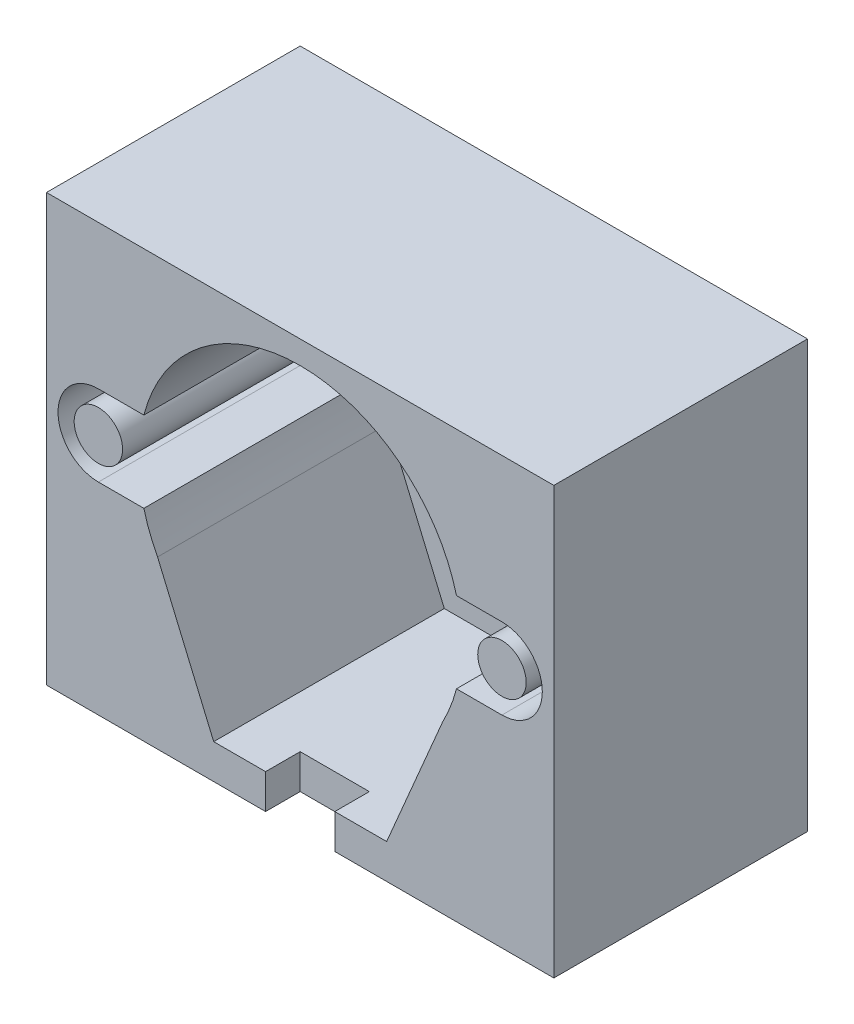
ISO-10303-21;
HEADER;
FILE_DESCRIPTION(('STEP AP214'),'2;1');
FILE_NAME('part.step','',(''),(''),'','','');
FILE_SCHEMA(('AUTOMOTIVE_DESIGN { 1 0 10303 214 1 1 1 1 }'));
ENDSEC;
DATA;
#1=APPLICATION_CONTEXT('core data for automotive mechanical design processes');
#2=APPLICATION_PROTOCOL_DEFINITION('international standard','automotive_design',2000,#1);
#3=PRODUCT_CONTEXT('',#1,'mechanical');
#4=PRODUCT('Part','Part','',(#3));
#5=PRODUCT_RELATED_PRODUCT_CATEGORY('part','',(#4));
#6=PRODUCT_DEFINITION_FORMATION('','',#4);
#7=PRODUCT_DEFINITION_CONTEXT('part definition',#1,'design');
#8=PRODUCT_DEFINITION('design','',#6,#7);
#9=PRODUCT_DEFINITION_SHAPE('','',#8);
#10=(LENGTH_UNIT() NAMED_UNIT(*) SI_UNIT(.MILLI.,.METRE.));
#11=(NAMED_UNIT(*) PLANE_ANGLE_UNIT() SI_UNIT($,.RADIAN.));
#12=(NAMED_UNIT(*) SI_UNIT($,.STERADIAN.) SOLID_ANGLE_UNIT());
#13=UNCERTAINTY_MEASURE_WITH_UNIT(LENGTH_MEASURE(1.E-05),#10,'distance_accuracy_value','');
#14=(GEOMETRIC_REPRESENTATION_CONTEXT(3) GLOBAL_UNCERTAINTY_ASSIGNED_CONTEXT((#13)) GLOBAL_UNIT_ASSIGNED_CONTEXT((#10,
#11,#12)) REPRESENTATION_CONTEXT('',''));
#15=CARTESIAN_POINT('',(0.,0.,0.));
#16=DIRECTION('',(0.,0.,1.));
#17=DIRECTION('',(1.,0.,0.));
#18=AXIS2_PLACEMENT_3D('',#15,#16,#17);
#19=CARTESIAN_POINT('',(22.,37.,22.));
#20=DIRECTION('',(-1.,0.,0.));
#21=DIRECTION('',(0.,-1.,0.));
#22=AXIS2_PLACEMENT_3D('',#19,#20,#21);
#23=PLANE('',#22);
#24=DIRECTION('',(0.,1.,0.));
#25=VECTOR('',#24,1.);
#26=CARTESIAN_POINT('',(22.,37.,0.));
#27=LINE('',#26,#25);
#28=CARTESIAN_POINT('',(22.,0.,0.));
#29=VERTEX_POINT('',#28);
#30=CARTESIAN_POINT('',(22.,37.,0.));
#31=VERTEX_POINT('',#30);
#32=EDGE_CURVE('E253',#29,#31,#27,.T.);
#33=ORIENTED_EDGE('',*,*,#32,.T.);
#34=DIRECTION('',(0.,0.,-1.));
#35=VECTOR('',#34,1.);
#36=CARTESIAN_POINT('',(22.,37.,22.));
#37=LINE('',#36,#35);
#38=CARTESIAN_POINT('',(22.,37.,22.));
#39=VERTEX_POINT('',#38);
#40=EDGE_CURVE('E11',#39,#31,#37,.T.);
#41=ORIENTED_EDGE('',*,*,#40,.F.);
#42=DIRECTION('',(0.,1.,0.));
#43=VECTOR('',#42,1.);
#44=CARTESIAN_POINT('',(22.,37.,22.));
#45=LINE('',#44,#43);
#46=CARTESIAN_POINT('',(22.,0.,22.));
#47=VERTEX_POINT('',#46);
#48=EDGE_CURVE('E288',#47,#39,#45,.T.);
#49=ORIENTED_EDGE('',*,*,#48,.F.);
#50=DIRECTION('',(0.,0.,-1.));
#51=VECTOR('',#50,1.);
#52=CARTESIAN_POINT('',(22.,0.,22.));
#53=LINE('',#52,#51);
#54=EDGE_CURVE('E302',#47,#29,#53,.T.);
#55=ORIENTED_EDGE('',*,*,#54,.T.);
#56=EDGE_LOOP('',(#33,#41,#49,#55));
#57=FACE_BOUND('',#56,.T.);
#58=ADVANCED_FACE('F39',(#57),#23,.F.);
#59=CARTESIAN_POINT('',(-22.,37.,22.));
#60=DIRECTION('',(0.,-1.,0.));
#61=DIRECTION('',(1.,0.,0.));
#62=AXIS2_PLACEMENT_3D('',#59,#60,#61);
#63=PLANE('',#62);
#64=DIRECTION('',(-1.,0.,0.));
#65=VECTOR('',#64,1.);
#66=CARTESIAN_POINT('',(-22.,37.,0.));
#67=LINE('',#66,#65);
#68=CARTESIAN_POINT('',(-22.,37.,0.));
#69=VERTEX_POINT('',#68);
#70=EDGE_CURVE('E306',#31,#69,#67,.T.);
#71=ORIENTED_EDGE('',*,*,#70,.T.);
#72=DIRECTION('',(0.,0.,-1.));
#73=VECTOR('',#72,1.);
#74=CARTESIAN_POINT('',(-22.,37.,22.));
#75=LINE('',#74,#73);
#76=CARTESIAN_POINT('',(-22.,37.,22.));
#77=VERTEX_POINT('',#76);
#78=EDGE_CURVE('E48',#77,#69,#75,.T.);
#79=ORIENTED_EDGE('',*,*,#78,.F.);
#80=DIRECTION('',(-1.,0.,0.));
#81=VECTOR('',#80,1.);
#82=CARTESIAN_POINT('',(-22.,37.,22.));
#83=LINE('',#82,#81);
#84=EDGE_CURVE('E292',#39,#77,#83,.T.);
#85=ORIENTED_EDGE('',*,*,#84,.F.);
#86=ORIENTED_EDGE('',*,*,#40,.T.);
#87=EDGE_LOOP('',(#71,#79,#85,#86));
#88=FACE_BOUND('',#87,.T.);
#89=ADVANCED_FACE('F471',(#88),#63,.F.);
#90=CARTESIAN_POINT('',(-22.,0.,22.));
#91=DIRECTION('',(1.,0.,0.));
#92=DIRECTION('',(0.,0.,-1.));
#93=AXIS2_PLACEMENT_3D('',#90,#91,#92);
#94=PLANE('',#93);
#95=DIRECTION('',(0.,-1.,0.));
#96=VECTOR('',#95,1.);
#97=CARTESIAN_POINT('',(-22.,0.,0.));
#98=LINE('',#97,#96);
#99=CARTESIAN_POINT('',(-22.,0.,0.));
#100=VERTEX_POINT('',#99);
#101=EDGE_CURVE('E309',#69,#100,#98,.T.);
#102=ORIENTED_EDGE('',*,*,#101,.T.);
#103=DIRECTION('',(0.,0.,-1.));
#104=VECTOR('',#103,1.);
#105=CARTESIAN_POINT('',(-22.,0.,22.));
#106=LINE('',#105,#104);
#107=CARTESIAN_POINT('',(-22.,0.,22.));
#108=VERTEX_POINT('',#107);
#109=EDGE_CURVE('E317',#108,#100,#106,.T.);
#110=ORIENTED_EDGE('',*,*,#109,.F.);
#111=DIRECTION('',(0.,-1.,0.));
#112=VECTOR('',#111,1.);
#113=CARTESIAN_POINT('',(-22.,0.,22.));
#114=LINE('',#113,#112);
#115=EDGE_CURVE('E296',#77,#108,#114,.T.);
#116=ORIENTED_EDGE('',*,*,#115,.F.);
#117=ORIENTED_EDGE('',*,*,#78,.T.);
#118=EDGE_LOOP('',(#102,#110,#116,#117));
#119=FACE_BOUND('',#118,.T.);
#120=ADVANCED_FACE('F327',(#119),#94,.F.);
#121=CARTESIAN_POINT('',(22.,0.,22.));
#122=DIRECTION('',(0.,1.,0.));
#123=DIRECTION('',(-1.,0.,0.));
#124=AXIS2_PLACEMENT_3D('',#121,#122,#123);
#125=PLANE('',#124);
#126=DIRECTION('',(1.,0.,0.));
#127=VECTOR('',#126,1.);
#128=CARTESIAN_POINT('',(22.,0.,22.));
#129=LINE('',#128,#127);
#130=CARTESIAN_POINT('',(3.00000000000001,0.,22.));
#131=VERTEX_POINT('',#130);
#132=EDGE_CURVE('E299',#131,#47,#129,.T.);
#133=ORIENTED_EDGE('',*,*,#132,.F.);
#134=DIRECTION('',(0.,0.,1.));
#135=VECTOR('',#134,1.);
#136=CARTESIAN_POINT('',(3.00000000000001,0.,22.));
#137=LINE('',#136,#135);
#138=CARTESIAN_POINT('',(3.00000000000001,0.,19.));
#139=VERTEX_POINT('',#138);
#140=EDGE_CURVE('E417',#139,#131,#137,.T.);
#141=ORIENTED_EDGE('',*,*,#140,.F.);
#142=DIRECTION('',(1.,0.,0.));
#143=VECTOR('',#142,1.);
#144=CARTESIAN_POINT('',(-2.99999999999999,0.,19.));
#145=LINE('',#144,#143);
#146=CARTESIAN_POINT('',(-2.99999999999999,0.,19.));
#147=VERTEX_POINT('',#146);
#148=EDGE_CURVE('E426',#147,#139,#145,.T.);
#149=ORIENTED_EDGE('',*,*,#148,.F.);
#150=DIRECTION('',(0.,0.,-1.));
#151=VECTOR('',#150,1.);
#152=CARTESIAN_POINT('',(-2.99999999999999,0.,22.));
#153=LINE('',#152,#151);
#154=CARTESIAN_POINT('',(-2.99999999999999,0.,22.));
#155=VERTEX_POINT('',#154);
#156=EDGE_CURVE('E422',#155,#147,#153,.T.);
#157=ORIENTED_EDGE('',*,*,#156,.F.);
#158=EDGE_CURVE('E195',#108,#155,#129,.T.);
#159=ORIENTED_EDGE('',*,*,#158,.F.);
#160=ORIENTED_EDGE('',*,*,#109,.T.);
#161=DIRECTION('',(1.,0.,0.));
#162=VECTOR('',#161,1.);
#163=CARTESIAN_POINT('',(22.,0.,0.));
#164=LINE('',#163,#162);
#165=EDGE_CURVE('E293',#100,#29,#164,.T.);
#166=ORIENTED_EDGE('',*,*,#165,.T.);
#167=ORIENTED_EDGE('',*,*,#54,.F.);
#168=EDGE_LOOP('',(#133,#141,#149,#157,#159,#160,#166,#167));
#169=FACE_BOUND('',#168,.T.);
#170=ADVANCED_FACE('F337',(#169),#125,.F.);
#171=CARTESIAN_POINT('',(0.,0.,22.));
#172=DIRECTION('',(0.,0.,-1.));
#173=DIRECTION('',(-1.,0.,0.));
#174=AXIS2_PLACEMENT_3D('',#171,#172,#173);
#175=PLANE('',#174);
#176=DIRECTION('',(1.,0.,0.));
#177=VECTOR('',#176,1.);
#178=CARTESIAN_POINT('',(-7.5,2.99999999999999,22.));
#179=LINE('',#178,#177);
#180=CARTESIAN_POINT('',(3.00000000000001,2.99999999999999,22.));
#181=VERTEX_POINT('',#180);
#182=CARTESIAN_POINT('',(7.5,2.99999999999999,22.));
#183=VERTEX_POINT('',#182);
#184=EDGE_CURVE('E204',#181,#183,#179,.T.);
#185=ORIENTED_EDGE('',*,*,#184,.F.);
#186=DIRECTION('',(0.,-1.,0.));
#187=VECTOR('',#186,1.);
#188=CARTESIAN_POINT('',(3.,37.001,22.));
#189=LINE('',#188,#187);
#190=EDGE_CURVE('E197',#181,#131,#189,.T.);
#191=ORIENTED_EDGE('',*,*,#190,.T.);
#192=ORIENTED_EDGE('',*,*,#132,.T.);
#193=ORIENTED_EDGE('',*,*,#48,.T.);
#194=ORIENTED_EDGE('',*,*,#84,.T.);
#195=ORIENTED_EDGE('',*,*,#115,.T.);
#196=ORIENTED_EDGE('',*,*,#158,.T.);
#197=DIRECTION('',(0.,-1.,0.));
#198=VECTOR('',#197,1.);
#199=CARTESIAN_POINT('',(-3.,37.001,22.));
#200=LINE('',#199,#198);
#201=CARTESIAN_POINT('',(-2.99999999999999,2.99999999999999,22.));
#202=VERTEX_POINT('',#201);
#203=EDGE_CURVE('E180',#202,#155,#200,.T.);
#204=ORIENTED_EDGE('',*,*,#203,.F.);
#205=CARTESIAN_POINT('',(-7.5,2.99999999999999,22.));
#206=VERTEX_POINT('',#205);
#207=EDGE_CURVE('E193',#206,#202,#179,.T.);
#208=ORIENTED_EDGE('',*,*,#207,.F.);
#209=DIRECTION('',(0.39154483745442,-0.920159029876245,0.));
#210=VECTOR('',#209,1.);
#211=CARTESIAN_POINT('',(-7.5,2.99999999999999,22.));
#212=LINE('',#211,#210);
#213=CARTESIAN_POINT('',(-12.3678315242219,14.4397604168396,22.));
#214=VERTEX_POINT('',#213);
#215=EDGE_CURVE('E63',#214,#206,#212,.T.);
#216=ORIENTED_EDGE('',*,*,#215,.F.);
#217=CARTESIAN_POINT('',(0.,21.,22.));
#218=DIRECTION('',(0.,0.,1.));
#219=DIRECTION('',(1.,0.,0.));
#220=AXIS2_PLACEMENT_3D('',#217,#218,#219);
#221=CIRCLE('',#220,14.);
#222=CARTESIAN_POINT('',(-13.555441711726,17.5,22.));
#223=VERTEX_POINT('',#222);
#224=EDGE_CURVE('E245',#223,#214,#221,.T.);
#225=ORIENTED_EDGE('',*,*,#224,.F.);
#226=DIRECTION('',(1.,0.,0.));
#227=VECTOR('',#226,1.);
#228=CARTESIAN_POINT('',(-17.5,17.5,22.));
#229=LINE('',#228,#227);
#230=CARTESIAN_POINT('',(-17.5,17.5,22.));
#231=VERTEX_POINT('',#230);
#232=EDGE_CURVE('E241',#231,#223,#229,.T.);
#233=ORIENTED_EDGE('',*,*,#232,.F.);
#234=CARTESIAN_POINT('',(-17.5,21.,22.));
#235=DIRECTION('',(0.,0.,1.));
#236=DIRECTION('',(1.,0.,0.));
#237=AXIS2_PLACEMENT_3D('',#234,#235,#236);
#238=CIRCLE('',#237,3.5);
#239=CARTESIAN_POINT('',(-17.5,24.5,22.));
#240=VERTEX_POINT('',#239);
#241=EDGE_CURVE('E237',#240,#231,#238,.T.);
#242=ORIENTED_EDGE('',*,*,#241,.F.);
#243=DIRECTION('',(-1.,0.,0.));
#244=VECTOR('',#243,1.);
#245=CARTESIAN_POINT('',(-17.5,24.5,22.));
#246=LINE('',#245,#244);
#247=CARTESIAN_POINT('',(-13.555441711726,24.5,22.));
#248=VERTEX_POINT('',#247);
#249=EDGE_CURVE('E233',#248,#240,#246,.T.);
#250=ORIENTED_EDGE('',*,*,#249,.F.);
#251=CARTESIAN_POINT('',(0.,21.,22.));
#252=DIRECTION('',(0.,0.,1.));
#253=DIRECTION('',(1.,0.,0.));
#254=AXIS2_PLACEMENT_3D('',#251,#252,#253);
#255=CIRCLE('',#254,14.);
#256=CARTESIAN_POINT('',(13.555441711726,24.5,22.));
#257=VERTEX_POINT('',#256);
#258=EDGE_CURVE('E229',#257,#248,#255,.T.);
#259=ORIENTED_EDGE('',*,*,#258,.F.);
#260=DIRECTION('',(-1.,0.,0.));
#261=VECTOR('',#260,1.);
#262=CARTESIAN_POINT('',(17.5,24.5,22.));
#263=LINE('',#262,#261);
#264=CARTESIAN_POINT('',(17.5,24.5,22.));
#265=VERTEX_POINT('',#264);
#266=EDGE_CURVE('E225',#265,#257,#263,.T.);
#267=ORIENTED_EDGE('',*,*,#266,.F.);
#268=CARTESIAN_POINT('',(17.5,21.,22.));
#269=DIRECTION('',(0.,0.,1.));
#270=DIRECTION('',(-1.,0.,0.));
#271=AXIS2_PLACEMENT_3D('',#268,#269,#270);
#272=CIRCLE('',#271,3.5);
#273=CARTESIAN_POINT('',(17.5,17.5,22.));
#274=VERTEX_POINT('',#273);
#275=EDGE_CURVE('E221',#274,#265,#272,.T.);
#276=ORIENTED_EDGE('',*,*,#275,.F.);
#277=DIRECTION('',(1.,0.,0.));
#278=VECTOR('',#277,1.);
#279=CARTESIAN_POINT('',(17.5,17.5,22.));
#280=LINE('',#279,#278);
#281=CARTESIAN_POINT('',(13.555441711726,17.5,22.));
#282=VERTEX_POINT('',#281);
#283=EDGE_CURVE('E217',#282,#274,#280,.T.);
#284=ORIENTED_EDGE('',*,*,#283,.F.);
#285=CARTESIAN_POINT('',(0.,21.,22.));
#286=DIRECTION('',(0.,0.,1.));
#287=DIRECTION('',(1.,0.,0.));
#288=AXIS2_PLACEMENT_3D('',#285,#286,#287);
#289=CIRCLE('',#288,14.);
#290=CARTESIAN_POINT('',(12.3678315242219,14.4397604168396,22.));
#291=VERTEX_POINT('',#290);
#292=EDGE_CURVE('E209',#291,#282,#289,.T.);
#293=ORIENTED_EDGE('',*,*,#292,.F.);
#294=DIRECTION('',(0.39154483745442,0.920159029876245,0.));
#295=VECTOR('',#294,1.);
#296=CARTESIAN_POINT('',(7.5,2.99999999999999,22.));
#297=LINE('',#296,#295);
#298=EDGE_CURVE('E203',#183,#291,#297,.T.);
#299=ORIENTED_EDGE('',*,*,#298,.F.);
#300=EDGE_LOOP('',(#185,#191,#192,#193,#194,#195,#196,#204,#208,#216,#225,#233,#242,#250,#259,
#267,#276,#284,#293,#299));
#301=FACE_BOUND('',#300,.T.);
#302=ADVANCED_FACE('F192',(#301),#175,.F.);
#303=CARTESIAN_POINT('',(0.,0.,0.));
#304=DIRECTION('',(0.,0.,-1.));
#305=DIRECTION('',(-1.,0.,0.));
#306=AXIS2_PLACEMENT_3D('',#303,#304,#305);
#307=PLANE('',#306);
#308=CARTESIAN_POINT('',(0.,20.9143154390346,0.));
#309=DIRECTION('',(0.,0.,-1.));
#310=DIRECTION('',(-1.,0.,0.));
#311=AXIS2_PLACEMENT_3D('',#308,#309,#310);
#312=CIRCLE('',#311,8.);
#313=CARTESIAN_POINT('',(-8.,20.9143154390346,0.));
#314=VERTEX_POINT('',#313);
#315=EDGE_CURVE('E408',#314,#314,#312,.T.);
#316=ORIENTED_EDGE('',*,*,#315,.F.);
#317=EDGE_LOOP('',(#316));
#318=FACE_BOUND('',#317,.T.);
#319=ORIENTED_EDGE('',*,*,#32,.F.);
#320=ORIENTED_EDGE('',*,*,#165,.F.);
#321=ORIENTED_EDGE('',*,*,#101,.F.);
#322=ORIENTED_EDGE('',*,*,#70,.F.);
#323=EDGE_LOOP('',(#319,#320,#321,#322));
#324=FACE_BOUND('',#323,.T.);
#325=ADVANCED_FACE('F333',(#318,#324),#307,.T.);
#326=CARTESIAN_POINT('',(-7.5,2.99999999999999,2.));
#327=DIRECTION('',(-0.920159029876245,-0.39154483745442,0.));
#328=DIRECTION('',(0.39154483745442,-0.920159029876245,0.));
#329=AXIS2_PLACEMENT_3D('',#326,#327,#328);
#330=PLANE('',#329);
#331=ORIENTED_EDGE('',*,*,#215,.T.);
#332=DIRECTION('',(0.,0.,1.));
#333=VECTOR('',#332,1.);
#334=CARTESIAN_POINT('',(-7.5,2.99999999999999,2.));
#335=LINE('',#334,#333);
#336=CARTESIAN_POINT('',(-7.5,2.99999999999999,2.));
#337=VERTEX_POINT('',#336);
#338=EDGE_CURVE('E201',#337,#206,#335,.T.);
#339=ORIENTED_EDGE('',*,*,#338,.F.);
#340=DIRECTION('',(0.39154483745442,-0.920159029876245,0.));
#341=VECTOR('',#340,1.);
#342=CARTESIAN_POINT('',(-7.5,2.99999999999999,2.));
#343=LINE('',#342,#341);
#344=CARTESIAN_POINT('',(-12.3678315242219,14.4397604168396,2.));
#345=VERTEX_POINT('',#344);
#346=EDGE_CURVE('E249',#345,#337,#343,.T.);
#347=ORIENTED_EDGE('',*,*,#346,.F.);
#348=DIRECTION('',(0.,0.,1.));
#349=VECTOR('',#348,1.);
#350=CARTESIAN_POINT('',(-12.3678315242219,14.4397604168396,2.));
#351=LINE('',#350,#349);
#352=EDGE_CURVE('E250',#345,#214,#351,.T.);
#353=ORIENTED_EDGE('',*,*,#352,.T.);
#354=EDGE_LOOP('',(#331,#339,#347,#353));
#355=FACE_BOUND('',#354,.T.);
#356=ADVANCED_FACE('F482',(#355),#330,.F.);
#357=CARTESIAN_POINT('',(0.,21.,2.));
#358=DIRECTION('',(0.,0.,1.));
#359=DIRECTION('',(1.,0.,0.));
#360=AXIS2_PLACEMENT_3D('',#357,#358,#359);
#361=CYLINDRICAL_SURFACE('',#360,14.);
#362=ORIENTED_EDGE('',*,*,#224,.T.);
#363=ORIENTED_EDGE('',*,*,#352,.F.);
#364=CARTESIAN_POINT('',(0.,21.,2.));
#365=DIRECTION('',(0.,0.,1.));
#366=DIRECTION('',(1.,0.,0.));
#367=AXIS2_PLACEMENT_3D('',#364,#365,#366);
#368=CIRCLE('',#367,14.);
#369=CARTESIAN_POINT('',(-13.555441711726,17.5,2.));
#370=VERTEX_POINT('',#369);
#371=EDGE_CURVE('E287',#370,#345,#368,.T.);
#372=ORIENTED_EDGE('',*,*,#371,.F.);
#373=DIRECTION('',(0.,0.,1.));
#374=VECTOR('',#373,1.);
#375=CARTESIAN_POINT('',(-13.555441711726,17.5,2.));
#376=LINE('',#375,#374);
#377=EDGE_CURVE('E254',#370,#223,#376,.T.);
#378=ORIENTED_EDGE('',*,*,#377,.T.);
#379=EDGE_LOOP('',(#362,#363,#372,#378));
#380=FACE_BOUND('',#379,.T.);
#381=ADVANCED_FACE('F487',(#380),#361,.F.);
#382=CARTESIAN_POINT('',(-17.5,17.5,2.));
#383=DIRECTION('',(0.,-1.,0.));
#384=DIRECTION('',(0.,0.,-1.));
#385=AXIS2_PLACEMENT_3D('',#382,#383,#384);
#386=PLANE('',#385);
#387=ORIENTED_EDGE('',*,*,#232,.T.);
#388=ORIENTED_EDGE('',*,*,#377,.F.);
#389=DIRECTION('',(1.,0.,0.));
#390=VECTOR('',#389,1.);
#391=CARTESIAN_POINT('',(-17.5,17.5,2.));
#392=LINE('',#391,#390);
#393=CARTESIAN_POINT('',(-17.5,17.5,2.));
#394=VERTEX_POINT('',#393);
#395=EDGE_CURVE('E347',#394,#370,#392,.T.);
#396=ORIENTED_EDGE('',*,*,#395,.F.);
#397=DIRECTION('',(0.,0.,1.));
#398=VECTOR('',#397,1.);
#399=CARTESIAN_POINT('',(-17.5,17.5,2.));
#400=LINE('',#399,#398);
#401=EDGE_CURVE('E257',#394,#231,#400,.T.);
#402=ORIENTED_EDGE('',*,*,#401,.T.);
#403=EDGE_LOOP('',(#387,#388,#396,#402));
#404=FACE_BOUND('',#403,.T.);
#405=ADVANCED_FACE('F501',(#404),#386,.F.);
#406=CARTESIAN_POINT('',(-17.5,21.,2.));
#407=DIRECTION('',(0.,0.,1.));
#408=DIRECTION('',(1.,0.,0.));
#409=AXIS2_PLACEMENT_3D('',#406,#407,#408);
#410=CYLINDRICAL_SURFACE('',#409,3.5);
#411=ORIENTED_EDGE('',*,*,#241,.T.);
#412=ORIENTED_EDGE('',*,*,#401,.F.);
#413=CARTESIAN_POINT('',(-17.5,21.,2.));
#414=DIRECTION('',(0.,0.,1.));
#415=DIRECTION('',(1.,0.,0.));
#416=AXIS2_PLACEMENT_3D('',#413,#414,#415);
#417=CIRCLE('',#416,3.5);
#418=CARTESIAN_POINT('',(-17.5,24.5,2.));
#419=VERTEX_POINT('',#418);
#420=EDGE_CURVE('E350',#419,#394,#417,.T.);
#421=ORIENTED_EDGE('',*,*,#420,.F.);
#422=DIRECTION('',(0.,0.,1.));
#423=VECTOR('',#422,1.);
#424=CARTESIAN_POINT('',(-17.5,24.5,2.));
#425=LINE('',#424,#423);
#426=EDGE_CURVE('E260',#419,#240,#425,.T.);
#427=ORIENTED_EDGE('',*,*,#426,.T.);
#428=EDGE_LOOP('',(#411,#412,#421,#427));
#429=FACE_BOUND('',#428,.T.);
#430=ADVANCED_FACE('F505',(#429),#410,.F.);
#431=CARTESIAN_POINT('',(-17.5,24.5,2.));
#432=DIRECTION('',(0.,1.,0.));
#433=DIRECTION('',(0.,0.,1.));
#434=AXIS2_PLACEMENT_3D('',#431,#432,#433);
#435=PLANE('',#434);
#436=ORIENTED_EDGE('',*,*,#249,.T.);
#437=ORIENTED_EDGE('',*,*,#426,.F.);
#438=DIRECTION('',(-1.,0.,0.));
#439=VECTOR('',#438,1.);
#440=CARTESIAN_POINT('',(-17.5,24.5,2.));
#441=LINE('',#440,#439);
#442=CARTESIAN_POINT('',(-13.555441711726,24.5,2.));
#443=VERTEX_POINT('',#442);
#444=EDGE_CURVE('E354',#443,#419,#441,.T.);
#445=ORIENTED_EDGE('',*,*,#444,.F.);
#446=DIRECTION('',(0.,0.,1.));
#447=VECTOR('',#446,1.);
#448=CARTESIAN_POINT('',(-13.555441711726,24.5,2.));
#449=LINE('',#448,#447);
#450=EDGE_CURVE('E263',#443,#248,#449,.T.);
#451=ORIENTED_EDGE('',*,*,#450,.T.);
#452=EDGE_LOOP('',(#436,#437,#445,#451));
#453=FACE_BOUND('',#452,.T.);
#454=ADVANCED_FACE('F509',(#453),#435,.F.);
#455=CARTESIAN_POINT('',(0.,21.,2.));
#456=DIRECTION('',(0.,0.,1.));
#457=DIRECTION('',(1.,0.,0.));
#458=AXIS2_PLACEMENT_3D('',#455,#456,#457);
#459=CYLINDRICAL_SURFACE('',#458,14.);
#460=ORIENTED_EDGE('',*,*,#258,.T.);
#461=ORIENTED_EDGE('',*,*,#450,.F.);
#462=CARTESIAN_POINT('',(0.,21.,2.));
#463=DIRECTION('',(0.,0.,1.));
#464=DIRECTION('',(1.,0.,0.));
#465=AXIS2_PLACEMENT_3D('',#462,#463,#464);
#466=CIRCLE('',#465,14.);
#467=CARTESIAN_POINT('',(13.555441711726,24.5,2.));
#468=VERTEX_POINT('',#467);
#469=EDGE_CURVE('E358',#468,#443,#466,.T.);
#470=ORIENTED_EDGE('',*,*,#469,.F.);
#471=DIRECTION('',(0.,0.,1.));
#472=VECTOR('',#471,1.);
#473=CARTESIAN_POINT('',(13.555441711726,24.5,2.));
#474=LINE('',#473,#472);
#475=EDGE_CURVE('E266',#468,#257,#474,.T.);
#476=ORIENTED_EDGE('',*,*,#475,.T.);
#477=EDGE_LOOP('',(#460,#461,#470,#476));
#478=FACE_BOUND('',#477,.T.);
#479=ADVANCED_FACE('F513',(#478),#459,.F.);
#480=CARTESIAN_POINT('',(17.5,24.5,2.));
#481=DIRECTION('',(0.,1.,0.));
#482=DIRECTION('',(0.,0.,1.));
#483=AXIS2_PLACEMENT_3D('',#480,#481,#482);
#484=PLANE('',#483);
#485=ORIENTED_EDGE('',*,*,#266,.T.);
#486=ORIENTED_EDGE('',*,*,#475,.F.);
#487=DIRECTION('',(-1.,0.,0.));
#488=VECTOR('',#487,1.);
#489=CARTESIAN_POINT('',(17.5,24.5,2.));
#490=LINE('',#489,#488);
#491=CARTESIAN_POINT('',(17.5,24.5,2.));
#492=VERTEX_POINT('',#491);
#493=EDGE_CURVE('E362',#492,#468,#490,.T.);
#494=ORIENTED_EDGE('',*,*,#493,.F.);
#495=DIRECTION('',(0.,0.,1.));
#496=VECTOR('',#495,1.);
#497=CARTESIAN_POINT('',(17.5,24.5,2.));
#498=LINE('',#497,#496);
#499=EDGE_CURVE('E269',#492,#265,#498,.T.);
#500=ORIENTED_EDGE('',*,*,#499,.T.);
#501=EDGE_LOOP('',(#485,#486,#494,#500));
#502=FACE_BOUND('',#501,.T.);
#503=ADVANCED_FACE('F517',(#502),#484,.F.);
#504=CARTESIAN_POINT('',(17.5,21.,2.));
#505=DIRECTION('',(0.,0.,1.));
#506=DIRECTION('',(1.,0.,0.));
#507=AXIS2_PLACEMENT_3D('',#504,#505,#506);
#508=CYLINDRICAL_SURFACE('',#507,3.5);
#509=ORIENTED_EDGE('',*,*,#275,.T.);
#510=ORIENTED_EDGE('',*,*,#499,.F.);
#511=CARTESIAN_POINT('',(17.5,21.,2.));
#512=DIRECTION('',(0.,0.,1.));
#513=DIRECTION('',(-1.,0.,0.));
#514=AXIS2_PLACEMENT_3D('',#511,#512,#513);
#515=CIRCLE('',#514,3.5);
#516=CARTESIAN_POINT('',(17.5,17.5,2.));
#517=VERTEX_POINT('',#516);
#518=EDGE_CURVE('E366',#517,#492,#515,.T.);
#519=ORIENTED_EDGE('',*,*,#518,.F.);
#520=DIRECTION('',(0.,0.,1.));
#521=VECTOR('',#520,1.);
#522=CARTESIAN_POINT('',(17.5,17.5,2.));
#523=LINE('',#522,#521);
#524=EDGE_CURVE('E272',#517,#274,#523,.T.);
#525=ORIENTED_EDGE('',*,*,#524,.T.);
#526=EDGE_LOOP('',(#509,#510,#519,#525));
#527=FACE_BOUND('',#526,.T.);
#528=ADVANCED_FACE('F521',(#527),#508,.F.);
#529=CARTESIAN_POINT('',(17.5,17.5,2.));
#530=DIRECTION('',(0.,-1.,0.));
#531=DIRECTION('',(0.,0.,-1.));
#532=AXIS2_PLACEMENT_3D('',#529,#530,#531);
#533=PLANE('',#532);
#534=ORIENTED_EDGE('',*,*,#283,.T.);
#535=ORIENTED_EDGE('',*,*,#524,.F.);
#536=DIRECTION('',(1.,0.,0.));
#537=VECTOR('',#536,1.);
#538=CARTESIAN_POINT('',(17.5,17.5,2.));
#539=LINE('',#538,#537);
#540=CARTESIAN_POINT('',(13.555441711726,17.5,2.));
#541=VERTEX_POINT('',#540);
#542=EDGE_CURVE('E370',#541,#517,#539,.T.);
#543=ORIENTED_EDGE('',*,*,#542,.F.);
#544=DIRECTION('',(0.,0.,1.));
#545=VECTOR('',#544,1.);
#546=CARTESIAN_POINT('',(13.555441711726,17.5,2.));
#547=LINE('',#546,#545);
#548=EDGE_CURVE('E275',#541,#282,#547,.T.);
#549=ORIENTED_EDGE('',*,*,#548,.T.);
#550=EDGE_LOOP('',(#534,#535,#543,#549));
#551=FACE_BOUND('',#550,.T.);
#552=ADVANCED_FACE('F525',(#551),#533,.F.);
#553=CARTESIAN_POINT('',(0.,21.,2.));
#554=DIRECTION('',(0.,0.,1.));
#555=DIRECTION('',(1.,0.,0.));
#556=AXIS2_PLACEMENT_3D('',#553,#554,#555);
#557=CYLINDRICAL_SURFACE('',#556,14.);
#558=ORIENTED_EDGE('',*,*,#292,.T.);
#559=ORIENTED_EDGE('',*,*,#548,.F.);
#560=CARTESIAN_POINT('',(0.,21.,2.));
#561=DIRECTION('',(0.,0.,1.));
#562=DIRECTION('',(1.,0.,0.));
#563=AXIS2_PLACEMENT_3D('',#560,#561,#562);
#564=CIRCLE('',#563,14.);
#565=CARTESIAN_POINT('',(12.3678315242219,14.4397604168396,2.));
#566=VERTEX_POINT('',#565);
#567=EDGE_CURVE('E374',#566,#541,#564,.T.);
#568=ORIENTED_EDGE('',*,*,#567,.F.);
#569=DIRECTION('',(0.,0.,1.));
#570=VECTOR('',#569,1.);
#571=CARTESIAN_POINT('',(12.3678315242219,14.4397604168396,2.));
#572=LINE('',#571,#570);
#573=EDGE_CURVE('E278',#566,#291,#572,.T.);
#574=ORIENTED_EDGE('',*,*,#573,.T.);
#575=EDGE_LOOP('',(#558,#559,#568,#574));
#576=FACE_BOUND('',#575,.T.);
#577=ADVANCED_FACE('F529',(#576),#557,.F.);
#578=CARTESIAN_POINT('',(7.5,2.99999999999999,2.));
#579=DIRECTION('',(0.920159029876245,-0.39154483745442,0.));
#580=DIRECTION('',(0.39154483745442,0.920159029876245,0.));
#581=AXIS2_PLACEMENT_3D('',#578,#579,#580);
#582=PLANE('',#581);
#583=ORIENTED_EDGE('',*,*,#298,.T.);
#584=ORIENTED_EDGE('',*,*,#573,.F.);
#585=DIRECTION('',(0.39154483745442,0.920159029876245,0.));
#586=VECTOR('',#585,1.);
#587=CARTESIAN_POINT('',(7.5,2.99999999999999,2.));
#588=LINE('',#587,#586);
#589=CARTESIAN_POINT('',(7.5,2.99999999999999,2.));
#590=VERTEX_POINT('',#589);
#591=EDGE_CURVE('E378',#590,#566,#588,.T.);
#592=ORIENTED_EDGE('',*,*,#591,.F.);
#593=DIRECTION('',(0.,0.,1.));
#594=VECTOR('',#593,1.);
#595=CARTESIAN_POINT('',(7.5,2.99999999999999,2.));
#596=LINE('',#595,#594);
#597=EDGE_CURVE('E281',#590,#183,#596,.T.);
#598=ORIENTED_EDGE('',*,*,#597,.T.);
#599=EDGE_LOOP('',(#583,#584,#592,#598));
#600=FACE_BOUND('',#599,.T.);
#601=ADVANCED_FACE('F533',(#600),#582,.F.);
#602=CARTESIAN_POINT('',(-7.5,2.99999999999999,2.));
#603=DIRECTION('',(0.,-1.,0.));
#604=DIRECTION('',(1.,0.,0.));
#605=AXIS2_PLACEMENT_3D('',#602,#603,#604);
#606=PLANE('',#605);
#607=DIRECTION('',(-1.,0.,0.));
#608=VECTOR('',#607,1.);
#609=CARTESIAN_POINT('',(-3.,2.99999999999999,19.));
#610=LINE('',#609,#608);
#611=CARTESIAN_POINT('',(3.00000000000001,2.99999999999999,19.));
#612=VERTEX_POINT('',#611);
#613=CARTESIAN_POINT('',(-2.99999999999999,2.99999999999999,19.));
#614=VERTEX_POINT('',#613);
#615=EDGE_CURVE('E55',#612,#614,#610,.T.);
#616=ORIENTED_EDGE('',*,*,#615,.F.);
#617=DIRECTION('',(0.,0.,-1.));
#618=VECTOR('',#617,1.);
#619=CARTESIAN_POINT('',(3.00000000000001,2.99999999999999,22.));
#620=LINE('',#619,#618);
#621=EDGE_CURVE('E186',#181,#612,#620,.T.);
#622=ORIENTED_EDGE('',*,*,#621,.F.);
#623=ORIENTED_EDGE('',*,*,#184,.T.);
#624=ORIENTED_EDGE('',*,*,#597,.F.);
#625=DIRECTION('',(1.,0.,0.));
#626=VECTOR('',#625,1.);
#627=CARTESIAN_POINT('',(-7.5,2.99999999999999,2.));
#628=LINE('',#627,#626);
#629=EDGE_CURVE('E382',#337,#590,#628,.T.);
#630=ORIENTED_EDGE('',*,*,#629,.F.);
#631=ORIENTED_EDGE('',*,*,#338,.T.);
#632=ORIENTED_EDGE('',*,*,#207,.T.);
#633=DIRECTION('',(0.,0.,1.));
#634=VECTOR('',#633,1.);
#635=CARTESIAN_POINT('',(-2.99999999999999,2.99999999999999,22.));
#636=LINE('',#635,#634);
#637=EDGE_CURVE('E176',#614,#202,#636,.T.);
#638=ORIENTED_EDGE('',*,*,#637,.F.);
#639=EDGE_LOOP('',(#616,#622,#623,#624,#630,#631,#632,#638));
#640=FACE_BOUND('',#639,.T.);
#641=ADVANCED_FACE('F199',(#640),#606,.F.);
#642=CARTESIAN_POINT('',(0.,21.,2.));
#643=DIRECTION('',(0.,0.,1.));
#644=DIRECTION('',(1.,0.,0.));
#645=AXIS2_PLACEMENT_3D('',#642,#643,#644);
#646=PLANE('',#645);
#647=CARTESIAN_POINT('',(0.,20.9143154390346,2.));
#648=DIRECTION('',(0.,0.,1.));
#649=DIRECTION('',(1.,0.,0.));
#650=AXIS2_PLACEMENT_3D('',#647,#648,#649);
#651=CIRCLE('',#650,8.);
#652=CARTESIAN_POINT('',(8.,20.9143154390346,2.));
#653=VERTEX_POINT('',#652);
#654=EDGE_CURVE('E42',#653,#653,#651,.T.);
#655=ORIENTED_EDGE('',*,*,#654,.F.);
#656=EDGE_LOOP('',(#655));
#657=FACE_BOUND('',#656,.T.);
#658=CARTESIAN_POINT('',(17.5,21.,2.));
#659=DIRECTION('',(0.,0.,1.));
#660=DIRECTION('',(-1.,0.,0.));
#661=AXIS2_PLACEMENT_3D('',#658,#659,#660);
#662=CIRCLE('',#661,2.1);
#663=CARTESIAN_POINT('',(15.4,21.,2.));
#664=VERTEX_POINT('',#663);
#665=EDGE_CURVE('E397',#664,#664,#662,.T.);
#666=ORIENTED_EDGE('',*,*,#665,.F.);
#667=EDGE_LOOP('',(#666));
#668=FACE_BOUND('',#667,.T.);
#669=CARTESIAN_POINT('',(-17.5,21.,2.));
#670=DIRECTION('',(0.,0.,1.));
#671=DIRECTION('',(1.,0.,0.));
#672=AXIS2_PLACEMENT_3D('',#669,#670,#671);
#673=CIRCLE('',#672,2.1);
#674=CARTESIAN_POINT('',(-15.4,21.,2.));
#675=VERTEX_POINT('',#674);
#676=EDGE_CURVE('E396',#675,#675,#673,.T.);
#677=ORIENTED_EDGE('',*,*,#676,.F.);
#678=EDGE_LOOP('',(#677));
#679=FACE_BOUND('',#678,.T.);
#680=ORIENTED_EDGE('',*,*,#346,.T.);
#681=ORIENTED_EDGE('',*,*,#629,.T.);
#682=ORIENTED_EDGE('',*,*,#591,.T.);
#683=ORIENTED_EDGE('',*,*,#567,.T.);
#684=ORIENTED_EDGE('',*,*,#542,.T.);
#685=ORIENTED_EDGE('',*,*,#518,.T.);
#686=ORIENTED_EDGE('',*,*,#493,.T.);
#687=ORIENTED_EDGE('',*,*,#469,.T.);
#688=ORIENTED_EDGE('',*,*,#444,.T.);
#689=ORIENTED_EDGE('',*,*,#420,.T.);
#690=ORIENTED_EDGE('',*,*,#395,.T.);
#691=ORIENTED_EDGE('',*,*,#371,.T.);
#692=EDGE_LOOP('',(#680,#681,#682,#683,#684,#685,#686,#687,#688,#689,#690,#691));
#693=FACE_BOUND('',#692,.T.);
#694=ADVANCED_FACE('F441',(#657,#668,#679,#693),#646,.T.);
#695=CARTESIAN_POINT('',(-17.5,21.,2.));
#696=DIRECTION('',(0.,0.,1.));
#697=DIRECTION('',(1.,0.,0.));
#698=AXIS2_PLACEMENT_3D('',#695,#696,#697);
#699=CYLINDRICAL_SURFACE('',#698,2.1);
#700=ORIENTED_EDGE('',*,*,#676,.T.);
#701=EDGE_LOOP('',(#700));
#702=FACE_BOUND('',#701,.T.);
#703=CARTESIAN_POINT('',(-17.5,21.,22.));
#704=DIRECTION('',(0.,0.,1.));
#705=DIRECTION('',(1.,0.,0.));
#706=AXIS2_PLACEMENT_3D('',#703,#704,#705);
#707=CIRCLE('',#706,2.1);
#708=CARTESIAN_POINT('',(-15.4,21.,22.));
#709=VERTEX_POINT('',#708);
#710=EDGE_CURVE('E392',#709,#709,#707,.T.);
#711=ORIENTED_EDGE('',*,*,#710,.F.);
#712=EDGE_LOOP('',(#711));
#713=FACE_BOUND('',#712,.T.);
#714=ADVANCED_FACE('F444',(#702,#713),#699,.T.);
#715=CARTESIAN_POINT('',(17.5,21.,2.));
#716=DIRECTION('',(0.,0.,1.));
#717=DIRECTION('',(1.,0.,0.));
#718=AXIS2_PLACEMENT_3D('',#715,#716,#717);
#719=CYLINDRICAL_SURFACE('',#718,2.1);
#720=ORIENTED_EDGE('',*,*,#665,.T.);
#721=EDGE_LOOP('',(#720));
#722=FACE_BOUND('',#721,.T.);
#723=CARTESIAN_POINT('',(17.5,21.,22.));
#724=DIRECTION('',(0.,0.,1.));
#725=DIRECTION('',(-1.,0.,0.));
#726=AXIS2_PLACEMENT_3D('',#723,#724,#725);
#727=CIRCLE('',#726,2.1);
#728=CARTESIAN_POINT('',(15.4,21.,22.));
#729=VERTEX_POINT('',#728);
#730=EDGE_CURVE('E401',#729,#729,#727,.T.);
#731=ORIENTED_EDGE('',*,*,#730,.F.);
#732=EDGE_LOOP('',(#731));
#733=FACE_BOUND('',#732,.T.);
#734=ADVANCED_FACE('F452',(#722,#733),#719,.T.);
#735=ORIENTED_EDGE('',*,*,#710,.T.);
#736=EDGE_LOOP('',(#735));
#737=FACE_BOUND('',#736,.T.);
#738=ADVANCED_FACE('F456',(#737),#175,.F.);
#739=ORIENTED_EDGE('',*,*,#730,.T.);
#740=EDGE_LOOP('',(#739));
#741=FACE_BOUND('',#740,.T.);
#742=ADVANCED_FACE('F458',(#741),#175,.F.);
#743=CARTESIAN_POINT('',(0.,20.9143154390346,22.));
#744=DIRECTION('',(0.,0.,-1.));
#745=DIRECTION('',(-1.,0.,0.));
#746=AXIS2_PLACEMENT_3D('',#743,#744,#745);
#747=CYLINDRICAL_SURFACE('',#746,8.);
#748=ORIENTED_EDGE('',*,*,#654,.T.);
#749=EDGE_LOOP('',(#748));
#750=FACE_BOUND('',#749,.T.);
#751=ORIENTED_EDGE('',*,*,#315,.T.);
#752=EDGE_LOOP('',(#751));
#753=FACE_BOUND('',#752,.T.);
#754=ADVANCED_FACE('F438',(#750,#753),#747,.F.);
#755=CARTESIAN_POINT('',(-3.,37.001,19.));
#756=DIRECTION('',(0.,0.,-1.));
#757=DIRECTION('',(-1.,0.,0.));
#758=AXIS2_PLACEMENT_3D('',#755,#756,#757);
#759=PLANE('',#758);
#760=ORIENTED_EDGE('',*,*,#615,.T.);
#761=DIRECTION('',(0.,-1.,0.));
#762=VECTOR('',#761,1.);
#763=CARTESIAN_POINT('',(-3.,37.001,19.));
#764=LINE('',#763,#762);
#765=EDGE_CURVE('E182',#614,#147,#764,.T.);
#766=ORIENTED_EDGE('',*,*,#765,.T.);
#767=ORIENTED_EDGE('',*,*,#148,.T.);
#768=DIRECTION('',(0.,-1.,0.));
#769=VECTOR('',#768,1.);
#770=CARTESIAN_POINT('',(3.,37.001,19.));
#771=LINE('',#770,#769);
#772=EDGE_CURVE('E414',#612,#139,#771,.T.);
#773=ORIENTED_EDGE('',*,*,#772,.F.);
#774=EDGE_LOOP('',(#760,#766,#767,#773));
#775=FACE_BOUND('',#774,.T.);
#776=ADVANCED_FACE('F490',(#775),#759,.F.);
#777=CARTESIAN_POINT('',(3.,37.001,22.));
#778=DIRECTION('',(1.,0.,0.));
#779=DIRECTION('',(0.,1.,0.));
#780=AXIS2_PLACEMENT_3D('',#777,#778,#779);
#781=PLANE('',#780);
#782=ORIENTED_EDGE('',*,*,#621,.T.);
#783=ORIENTED_EDGE('',*,*,#772,.T.);
#784=ORIENTED_EDGE('',*,*,#140,.T.);
#785=ORIENTED_EDGE('',*,*,#190,.F.);
#786=EDGE_LOOP('',(#782,#783,#784,#785));
#787=FACE_BOUND('',#786,.T.);
#788=ADVANCED_FACE('F495',(#787),#781,.F.);
#789=CARTESIAN_POINT('',(-3.,37.001,22.));
#790=DIRECTION('',(-1.,0.,0.));
#791=DIRECTION('',(0.,-1.,0.));
#792=AXIS2_PLACEMENT_3D('',#789,#790,#791);
#793=PLANE('',#792);
#794=ORIENTED_EDGE('',*,*,#637,.T.);
#795=ORIENTED_EDGE('',*,*,#203,.T.);
#796=ORIENTED_EDGE('',*,*,#156,.T.);
#797=ORIENTED_EDGE('',*,*,#765,.F.);
#798=EDGE_LOOP('',(#794,#795,#796,#797));
#799=FACE_BOUND('',#798,.T.);
#800=ADVANCED_FACE('F178',(#799),#793,.F.);
#801=CLOSED_SHELL('',(#58,#89,#120,#170,#302,#325,#356,#381,#405,#430,#454,#479,#503,#528,#552,
#577,#601,#641,#694,#714,#734,#738,#742,#754,#776,#788,#800));
#802=MANIFOLD_SOLID_BREP('B2',#801);
#803=ADVANCED_BREP_SHAPE_REPRESENTATION('',(#18,#802),#14);
#804=SHAPE_DEFINITION_REPRESENTATION(#9,#803);
ENDSEC;
END-ISO-10303-21;
